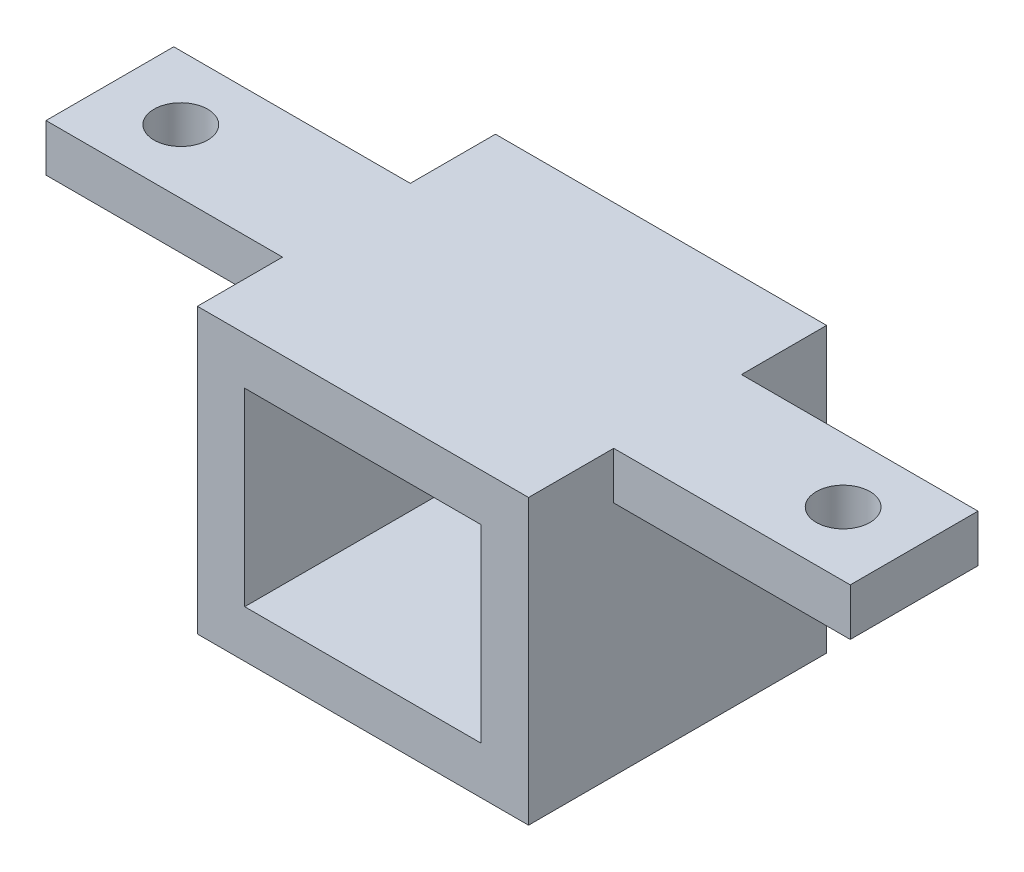
ISO-10303-21;
HEADER;
FILE_DESCRIPTION(('STEP AP214'),'2;1');
FILE_NAME('part.step','',(''),(''),'','','');
FILE_SCHEMA(('AUTOMOTIVE_DESIGN { 1 0 10303 214 1 1 1 1 }'));
ENDSEC;
DATA;
#1=APPLICATION_CONTEXT('core data for automotive mechanical design processes');
#2=APPLICATION_PROTOCOL_DEFINITION('international standard','automotive_design',2000,#1);
#3=PRODUCT_CONTEXT('',#1,'mechanical');
#4=PRODUCT('Part','Part','',(#3));
#5=PRODUCT_RELATED_PRODUCT_CATEGORY('part','',(#4));
#6=PRODUCT_DEFINITION_FORMATION('','',#4);
#7=PRODUCT_DEFINITION_CONTEXT('part definition',#1,'design');
#8=PRODUCT_DEFINITION('design','',#6,#7);
#9=PRODUCT_DEFINITION_SHAPE('','',#8);
#10=(LENGTH_UNIT() NAMED_UNIT(*) SI_UNIT(.MILLI.,.METRE.));
#11=(NAMED_UNIT(*) PLANE_ANGLE_UNIT() SI_UNIT($,.RADIAN.));
#12=(NAMED_UNIT(*) SI_UNIT($,.STERADIAN.) SOLID_ANGLE_UNIT());
#13=UNCERTAINTY_MEASURE_WITH_UNIT(LENGTH_MEASURE(1.E-05),#10,'distance_accuracy_value','');
#14=(GEOMETRIC_REPRESENTATION_CONTEXT(3) GLOBAL_UNCERTAINTY_ASSIGNED_CONTEXT((#13)) GLOBAL_UNIT_ASSIGNED_CONTEXT((#10,
#11,#12)) REPRESENTATION_CONTEXT('',''));
#15=CARTESIAN_POINT('',(0.,0.,0.));
#16=DIRECTION('',(0.,0.,1.));
#17=DIRECTION('',(1.,0.,0.));
#18=AXIS2_PLACEMENT_3D('',#15,#16,#17);
#19=CARTESIAN_POINT('',(0.,0.,0.));
#20=DIRECTION('',(0.,1.,0.));
#21=DIRECTION('',(0.,0.,1.));
#22=AXIS2_PLACEMENT_3D('',#19,#20,#21);
#23=PLANE('',#22);
#24=CARTESIAN_POINT('',(17.78,0.,0.));
#25=DIRECTION('',(0.,-1.,0.));
#26=DIRECTION('',(0.,0.,-1.));
#27=AXIS2_PLACEMENT_3D('',#24,#25,#26);
#28=CIRCLE('',#27,1.44);
#29=CARTESIAN_POINT('',(17.78,0.,-1.44));
#30=VERTEX_POINT('',#29);
#31=EDGE_CURVE('E214',#30,#30,#28,.T.);
#32=ORIENTED_EDGE('',*,*,#31,.F.);
#33=EDGE_LOOP('',(#32));
#34=FACE_BOUND('',#33,.T.);
#35=DIRECTION('',(0.,0.,1.));
#36=VECTOR('',#35,1.);
#37=CARTESIAN_POINT('',(8.89,0.,0.));
#38=LINE('',#37,#36);
#39=CARTESIAN_POINT('',(8.89,0.,-3.429));
#40=VERTEX_POINT('',#39);
#41=CARTESIAN_POINT('',(8.89,0.,3.429));
#42=VERTEX_POINT('',#41);
#43=EDGE_CURVE('E11',#40,#42,#38,.T.);
#44=ORIENTED_EDGE('',*,*,#43,.F.);
#45=DIRECTION('',(1.,0.,0.));
#46=VECTOR('',#45,1.);
#47=CARTESIAN_POINT('',(0.,0.,-3.429));
#48=LINE('',#47,#46);
#49=CARTESIAN_POINT('',(21.59,0.,-3.429));
#50=VERTEX_POINT('',#49);
#51=EDGE_CURVE('E258',#40,#50,#48,.T.);
#52=ORIENTED_EDGE('',*,*,#51,.T.);
#53=DIRECTION('',(0.,0.,1.));
#54=VECTOR('',#53,1.);
#55=CARTESIAN_POINT('',(21.59,0.,0.));
#56=LINE('',#55,#54);
#57=CARTESIAN_POINT('',(21.59,0.,3.429));
#58=VERTEX_POINT('',#57);
#59=EDGE_CURVE('E255',#50,#58,#56,.T.);
#60=ORIENTED_EDGE('',*,*,#59,.T.);
#61=DIRECTION('',(1.,0.,0.));
#62=VECTOR('',#61,1.);
#63=CARTESIAN_POINT('',(0.,0.,3.429));
#64=LINE('',#63,#62);
#65=EDGE_CURVE('E252',#42,#58,#64,.T.);
#66=ORIENTED_EDGE('',*,*,#65,.F.);
#67=EDGE_LOOP('',(#44,#52,#60,#66));
#68=FACE_BOUND('',#67,.T.);
#69=ADVANCED_FACE('F33',(#34,#68),#23,.F.);
#70=CARTESIAN_POINT('',(-17.78,0.,0.));
#71=DIRECTION('',(0.,-1.,0.));
#72=DIRECTION('',(0.,0.,-1.));
#73=AXIS2_PLACEMENT_3D('',#70,#71,#72);
#74=CIRCLE('',#73,1.44000000000011);
#75=CARTESIAN_POINT('',(-17.78,0.,-1.44000000000011));
#76=VERTEX_POINT('',#75);
#77=EDGE_CURVE('E211',#76,#76,#74,.T.);
#78=ORIENTED_EDGE('',*,*,#77,.F.);
#79=EDGE_LOOP('',(#78));
#80=FACE_BOUND('',#79,.T.);
#81=DIRECTION('',(0.,0.,-1.));
#82=VECTOR('',#81,1.);
#83=CARTESIAN_POINT('',(-8.89,0.,0.));
#84=LINE('',#83,#82);
#85=CARTESIAN_POINT('',(-8.89,0.,3.429));
#86=VERTEX_POINT('',#85);
#87=CARTESIAN_POINT('',(-8.89,0.,-3.429));
#88=VERTEX_POINT('',#87);
#89=EDGE_CURVE('E42',#86,#88,#84,.T.);
#90=ORIENTED_EDGE('',*,*,#89,.F.);
#91=DIRECTION('',(-1.,0.,0.));
#92=VECTOR('',#91,1.);
#93=CARTESIAN_POINT('',(0.,0.,3.429));
#94=LINE('',#93,#92);
#95=CARTESIAN_POINT('',(-21.59,0.,3.429));
#96=VERTEX_POINT('',#95);
#97=EDGE_CURVE('E227',#86,#96,#94,.T.);
#98=ORIENTED_EDGE('',*,*,#97,.T.);
#99=DIRECTION('',(0.,0.,1.));
#100=VECTOR('',#99,1.);
#101=CARTESIAN_POINT('',(-21.59,0.,0.));
#102=LINE('',#101,#100);
#103=CARTESIAN_POINT('',(-21.59,0.,-3.429));
#104=VERTEX_POINT('',#103);
#105=EDGE_CURVE('E263',#104,#96,#102,.T.);
#106=ORIENTED_EDGE('',*,*,#105,.F.);
#107=DIRECTION('',(-1.,0.,0.));
#108=VECTOR('',#107,1.);
#109=CARTESIAN_POINT('',(0.,0.,-3.429));
#110=LINE('',#109,#108);
#111=EDGE_CURVE('E261',#88,#104,#110,.T.);
#112=ORIENTED_EDGE('',*,*,#111,.F.);
#113=EDGE_LOOP('',(#90,#98,#106,#112));
#114=FACE_BOUND('',#113,.T.);
#115=ADVANCED_FACE('F329',(#80,#114),#23,.F.);
#116=CARTESIAN_POINT('',(0.,2.54,8.001));
#117=DIRECTION('',(0.,0.,1.));
#118=DIRECTION('',(1.,0.,0.));
#119=AXIS2_PLACEMENT_3D('',#116,#117,#118);
#120=PLANE('',#119);
#121=DIRECTION('',(0.,-1.,0.));
#122=VECTOR('',#121,1.);
#123=CARTESIAN_POINT('',(-8.89,2.54,8.001));
#124=LINE('',#123,#122);
#125=CARTESIAN_POINT('',(-8.89,2.54,8.001));
#126=VERTEX_POINT('',#125);
#127=CARTESIAN_POINT('',(-8.89,-12.7,8.001));
#128=VERTEX_POINT('',#127);
#129=EDGE_CURVE('E196',#126,#128,#124,.T.);
#130=ORIENTED_EDGE('',*,*,#129,.T.);
#131=DIRECTION('',(-1.,0.,0.));
#132=VECTOR('',#131,1.);
#133=CARTESIAN_POINT('',(-8.89,-12.7,8.001));
#134=LINE('',#133,#132);
#135=CARTESIAN_POINT('',(8.89,-12.7,8.001));
#136=VERTEX_POINT('',#135);
#137=EDGE_CURVE('E172',#136,#128,#134,.T.);
#138=ORIENTED_EDGE('',*,*,#137,.F.);
#139=DIRECTION('',(0.,-1.,0.));
#140=VECTOR('',#139,1.);
#141=CARTESIAN_POINT('',(8.89,2.54,8.001));
#142=LINE('',#141,#140);
#143=CARTESIAN_POINT('',(8.89,2.54,8.001));
#144=VERTEX_POINT('',#143);
#145=EDGE_CURVE('E286',#144,#136,#142,.T.);
#146=ORIENTED_EDGE('',*,*,#145,.F.);
#147=DIRECTION('',(-1.,0.,0.));
#148=VECTOR('',#147,1.);
#149=CARTESIAN_POINT('',(0.,2.54,8.001));
#150=LINE('',#149,#148);
#151=EDGE_CURVE('E226',#144,#126,#150,.T.);
#152=ORIENTED_EDGE('',*,*,#151,.T.);
#153=EDGE_LOOP('',(#130,#138,#146,#152));
#154=FACE_BOUND('',#153,.T.);
#155=DIRECTION('',(-1.,0.,0.));
#156=VECTOR('',#155,1.);
#157=CARTESIAN_POINT('',(0.,0.,8.001));
#158=LINE('',#157,#156);
#159=CARTESIAN_POINT('',(6.35,0.,8.001));
#160=VERTEX_POINT('',#159);
#161=CARTESIAN_POINT('',(-6.35,0.,8.001));
#162=VERTEX_POINT('',#161);
#163=EDGE_CURVE('E220',#160,#162,#158,.T.);
#164=ORIENTED_EDGE('',*,*,#163,.F.);
#165=DIRECTION('',(0.,1.,0.));
#166=VECTOR('',#165,1.);
#167=CARTESIAN_POINT('',(6.35,-10.16,8.001));
#168=LINE('',#167,#166);
#169=CARTESIAN_POINT('',(6.35,-10.16,8.001));
#170=VERTEX_POINT('',#169);
#171=EDGE_CURVE('E204',#170,#160,#168,.T.);
#172=ORIENTED_EDGE('',*,*,#171,.F.);
#173=DIRECTION('',(-1.,0.,0.));
#174=VECTOR('',#173,1.);
#175=CARTESIAN_POINT('',(-8.89,-10.16,8.001));
#176=LINE('',#175,#174);
#177=CARTESIAN_POINT('',(-6.35,-10.16,8.001));
#178=VERTEX_POINT('',#177);
#179=EDGE_CURVE('E173',#170,#178,#176,.T.);
#180=ORIENTED_EDGE('',*,*,#179,.T.);
#181=DIRECTION('',(0.,1.,0.));
#182=VECTOR('',#181,1.);
#183=CARTESIAN_POINT('',(-6.35,-10.16,8.001));
#184=LINE('',#183,#182);
#185=EDGE_CURVE('E207',#178,#162,#184,.T.);
#186=ORIENTED_EDGE('',*,*,#185,.T.);
#187=EDGE_LOOP('',(#164,#172,#180,#186));
#188=FACE_BOUND('',#187,.T.);
#189=ADVANCED_FACE('F35',(#154,#188),#120,.T.);
#190=CARTESIAN_POINT('',(0.,2.54,3.429));
#191=DIRECTION('',(0.,0.,-1.));
#192=DIRECTION('',(-1.,0.,0.));
#193=AXIS2_PLACEMENT_3D('',#190,#191,#192);
#194=PLANE('',#193);
#195=ORIENTED_EDGE('',*,*,#65,.T.);
#196=DIRECTION('',(0.,-1.,0.));
#197=VECTOR('',#196,1.);
#198=CARTESIAN_POINT('',(21.59,2.54,3.429));
#199=LINE('',#198,#197);
#200=CARTESIAN_POINT('',(21.59,2.54,3.429));
#201=VERTEX_POINT('',#200);
#202=EDGE_CURVE('E282',#201,#58,#199,.T.);
#203=ORIENTED_EDGE('',*,*,#202,.F.);
#204=DIRECTION('',(1.,0.,0.));
#205=VECTOR('',#204,1.);
#206=CARTESIAN_POINT('',(0.,2.54,3.429));
#207=LINE('',#206,#205);
#208=CARTESIAN_POINT('',(8.89,2.54,3.429));
#209=VERTEX_POINT('',#208);
#210=EDGE_CURVE('E232',#209,#201,#207,.T.);
#211=ORIENTED_EDGE('',*,*,#210,.F.);
#212=DIRECTION('',(0.,-1.,0.));
#213=VECTOR('',#212,1.);
#214=CARTESIAN_POINT('',(8.89,2.54,3.429));
#215=LINE('',#214,#213);
#216=EDGE_CURVE('E284',#209,#42,#215,.T.);
#217=ORIENTED_EDGE('',*,*,#216,.T.);
#218=EDGE_LOOP('',(#195,#203,#211,#217));
#219=FACE_BOUND('',#218,.T.);
#220=ADVANCED_FACE('F411',(#219),#194,.F.);
#221=CARTESIAN_POINT('',(21.59,2.54,0.));
#222=DIRECTION('',(1.,0.,0.));
#223=DIRECTION('',(0.,0.,-1.));
#224=AXIS2_PLACEMENT_3D('',#221,#222,#223);
#225=PLANE('',#224);
#226=ORIENTED_EDGE('',*,*,#59,.F.);
#227=DIRECTION('',(0.,-1.,0.));
#228=VECTOR('',#227,1.);
#229=CARTESIAN_POINT('',(21.59,2.54,-3.429));
#230=LINE('',#229,#228);
#231=CARTESIAN_POINT('',(21.59,2.54,-3.429));
#232=VERTEX_POINT('',#231);
#233=EDGE_CURVE('E280',#232,#50,#230,.T.);
#234=ORIENTED_EDGE('',*,*,#233,.F.);
#235=DIRECTION('',(0.,0.,1.));
#236=VECTOR('',#235,1.);
#237=CARTESIAN_POINT('',(21.59,2.54,0.));
#238=LINE('',#237,#236);
#239=EDGE_CURVE('E235',#232,#201,#238,.T.);
#240=ORIENTED_EDGE('',*,*,#239,.T.);
#241=ORIENTED_EDGE('',*,*,#202,.T.);
#242=EDGE_LOOP('',(#226,#234,#240,#241));
#243=FACE_BOUND('',#242,.T.);
#244=ADVANCED_FACE('F414',(#243),#225,.T.);
#245=CARTESIAN_POINT('',(0.,2.54,-3.429));
#246=DIRECTION('',(0.,0.,-1.));
#247=DIRECTION('',(-1.,0.,0.));
#248=AXIS2_PLACEMENT_3D('',#245,#246,#247);
#249=PLANE('',#248);
#250=ORIENTED_EDGE('',*,*,#51,.F.);
#251=DIRECTION('',(0.,-1.,0.));
#252=VECTOR('',#251,1.);
#253=CARTESIAN_POINT('',(8.89,2.54,-3.429));
#254=LINE('',#253,#252);
#255=CARTESIAN_POINT('',(8.89,2.54,-3.429));
#256=VERTEX_POINT('',#255);
#257=EDGE_CURVE('E277',#256,#40,#254,.T.);
#258=ORIENTED_EDGE('',*,*,#257,.F.);
#259=DIRECTION('',(1.,0.,0.));
#260=VECTOR('',#259,1.);
#261=CARTESIAN_POINT('',(0.,2.54,-3.429));
#262=LINE('',#261,#260);
#263=EDGE_CURVE('E238',#256,#232,#262,.T.);
#264=ORIENTED_EDGE('',*,*,#263,.T.);
#265=ORIENTED_EDGE('',*,*,#233,.T.);
#266=EDGE_LOOP('',(#250,#258,#264,#265));
#267=FACE_BOUND('',#266,.T.);
#268=ADVANCED_FACE('F417',(#267),#249,.T.);
#269=CARTESIAN_POINT('',(8.89,2.54,0.));
#270=DIRECTION('',(-1.,0.,0.));
#271=DIRECTION('',(0.,0.,1.));
#272=AXIS2_PLACEMENT_3D('',#269,#270,#271);
#273=PLANE('',#272);
#274=ORIENTED_EDGE('',*,*,#257,.T.);
#275=ORIENTED_EDGE('',*,*,#43,.T.);
#276=ORIENTED_EDGE('',*,*,#216,.F.);
#277=DIRECTION('',(0.,0.,-1.));
#278=VECTOR('',#277,1.);
#279=CARTESIAN_POINT('',(8.89,2.54,0.));
#280=LINE('',#279,#278);
#281=EDGE_CURVE('E230',#144,#209,#280,.T.);
#282=ORIENTED_EDGE('',*,*,#281,.F.);
#283=ORIENTED_EDGE('',*,*,#145,.T.);
#284=DIRECTION('',(0.,0.,1.));
#285=VECTOR('',#284,1.);
#286=CARTESIAN_POINT('',(8.89,-12.7,8.001));
#287=LINE('',#286,#285);
#288=CARTESIAN_POINT('',(8.89,-12.7,-8.001));
#289=VERTEX_POINT('',#288);
#290=EDGE_CURVE('E167',#289,#136,#287,.T.);
#291=ORIENTED_EDGE('',*,*,#290,.F.);
#292=DIRECTION('',(0.,-1.,0.));
#293=VECTOR('',#292,1.);
#294=CARTESIAN_POINT('',(8.89,2.54,-8.001));
#295=LINE('',#294,#293);
#296=CARTESIAN_POINT('',(8.89,2.54,-8.001));
#297=VERTEX_POINT('',#296);
#298=EDGE_CURVE('E157',#297,#289,#295,.T.);
#299=ORIENTED_EDGE('',*,*,#298,.F.);
#300=EDGE_CURVE('E233',#256,#297,#280,.T.);
#301=ORIENTED_EDGE('',*,*,#300,.F.);
#302=EDGE_LOOP('',(#274,#275,#276,#282,#283,#291,#299,#301));
#303=FACE_BOUND('',#302,.T.);
#304=ADVANCED_FACE('F308',(#303),#273,.F.);
#305=CARTESIAN_POINT('',(0.,2.54,-8.001));
#306=DIRECTION('',(0.,0.,1.));
#307=DIRECTION('',(1.,0.,0.));
#308=AXIS2_PLACEMENT_3D('',#305,#306,#307);
#309=PLANE('',#308);
#310=CARTESIAN_POINT('',(0.,-5.08,-8.001));
#311=DIRECTION('',(0.,0.,-1.));
#312=DIRECTION('',(-1.,0.,0.));
#313=AXIS2_PLACEMENT_3D('',#310,#311,#312);
#314=CIRCLE('',#313,2.);
#315=CARTESIAN_POINT('',(-2.,-5.08,-8.001));
#316=VERTEX_POINT('',#315);
#317=EDGE_CURVE('E292',#316,#316,#314,.T.);
#318=ORIENTED_EDGE('',*,*,#317,.F.);
#319=EDGE_LOOP('',(#318));
#320=FACE_BOUND('',#319,.T.);
#321=CARTESIAN_POINT('',(-4.699,-5.08,-8.001));
#322=DIRECTION('',(0.,0.,-1.));
#323=DIRECTION('',(-1.,0.,0.));
#324=AXIS2_PLACEMENT_3D('',#321,#322,#323);
#325=CIRCLE('',#324,0.800000000000001);
#326=CARTESIAN_POINT('',(-5.499,-5.08,-8.001));
#327=VERTEX_POINT('',#326);
#328=EDGE_CURVE('E297',#327,#327,#325,.T.);
#329=ORIENTED_EDGE('',*,*,#328,.F.);
#330=EDGE_LOOP('',(#329));
#331=FACE_BOUND('',#330,.T.);
#332=CARTESIAN_POINT('',(4.699,-5.08,-8.001));
#333=DIRECTION('',(0.,0.,-1.));
#334=DIRECTION('',(-1.,0.,0.));
#335=AXIS2_PLACEMENT_3D('',#332,#333,#334);
#336=CIRCLE('',#335,0.800000000000001);
#337=CARTESIAN_POINT('',(3.899,-5.08,-8.001));
#338=VERTEX_POINT('',#337);
#339=EDGE_CURVE('E179',#338,#338,#336,.T.);
#340=ORIENTED_EDGE('',*,*,#339,.F.);
#341=EDGE_LOOP('',(#340));
#342=FACE_BOUND('',#341,.T.);
#343=ORIENTED_EDGE('',*,*,#298,.T.);
#344=DIRECTION('',(1.,0.,0.));
#345=VECTOR('',#344,1.);
#346=CARTESIAN_POINT('',(-8.89,-12.7,-8.001));
#347=LINE('',#346,#345);
#348=CARTESIAN_POINT('',(-8.89,-12.7,-8.001));
#349=VERTEX_POINT('',#348);
#350=EDGE_CURVE('E161',#349,#289,#347,.T.);
#351=ORIENTED_EDGE('',*,*,#350,.F.);
#352=DIRECTION('',(0.,-1.,0.));
#353=VECTOR('',#352,1.);
#354=CARTESIAN_POINT('',(-8.89,2.54,-8.001));
#355=LINE('',#354,#353);
#356=CARTESIAN_POINT('',(-8.89,2.54,-8.001));
#357=VERTEX_POINT('',#356);
#358=EDGE_CURVE('E148',#357,#349,#355,.T.);
#359=ORIENTED_EDGE('',*,*,#358,.F.);
#360=DIRECTION('',(-1.,0.,0.));
#361=VECTOR('',#360,1.);
#362=CARTESIAN_POINT('',(0.,2.54,-8.001));
#363=LINE('',#362,#361);
#364=EDGE_CURVE('E241',#297,#357,#363,.T.);
#365=ORIENTED_EDGE('',*,*,#364,.F.);
#366=EDGE_LOOP('',(#343,#351,#359,#365));
#367=FACE_BOUND('',#366,.T.);
#368=ADVANCED_FACE('F162',(#320,#331,#342,#367),#309,.F.);
#369=CARTESIAN_POINT('',(-8.89,2.54,0.));
#370=DIRECTION('',(-1.,0.,0.));
#371=DIRECTION('',(0.,0.,1.));
#372=AXIS2_PLACEMENT_3D('',#369,#370,#371);
#373=PLANE('',#372);
#374=ORIENTED_EDGE('',*,*,#358,.T.);
#375=DIRECTION('',(0.,0.,-1.));
#376=VECTOR('',#375,1.);
#377=CARTESIAN_POINT('',(-8.89,-12.7,8.001));
#378=LINE('',#377,#376);
#379=EDGE_CURVE('E152',#128,#349,#378,.T.);
#380=ORIENTED_EDGE('',*,*,#379,.F.);
#381=ORIENTED_EDGE('',*,*,#129,.F.);
#382=DIRECTION('',(0.,0.,-1.));
#383=VECTOR('',#382,1.);
#384=CARTESIAN_POINT('',(-8.89,2.54,0.));
#385=LINE('',#384,#383);
#386=CARTESIAN_POINT('',(-8.89,2.54,3.429));
#387=VERTEX_POINT('',#386);
#388=EDGE_CURVE('E223',#126,#387,#385,.T.);
#389=ORIENTED_EDGE('',*,*,#388,.T.);
#390=DIRECTION('',(0.,-1.,0.));
#391=VECTOR('',#390,1.);
#392=CARTESIAN_POINT('',(-8.89,2.54,3.429));
#393=LINE('',#392,#391);
#394=EDGE_CURVE('E250',#387,#86,#393,.T.);
#395=ORIENTED_EDGE('',*,*,#394,.T.);
#396=ORIENTED_EDGE('',*,*,#89,.T.);
#397=DIRECTION('',(0.,-1.,0.));
#398=VECTOR('',#397,1.);
#399=CARTESIAN_POINT('',(-8.89,2.54,-3.429));
#400=LINE('',#399,#398);
#401=CARTESIAN_POINT('',(-8.89,2.54,-3.429));
#402=VERTEX_POINT('',#401);
#403=EDGE_CURVE('E158',#402,#88,#400,.T.);
#404=ORIENTED_EDGE('',*,*,#403,.F.);
#405=EDGE_CURVE('E154',#402,#357,#385,.T.);
#406=ORIENTED_EDGE('',*,*,#405,.T.);
#407=EDGE_LOOP('',(#374,#380,#381,#389,#395,#396,#404,#406));
#408=FACE_BOUND('',#407,.T.);
#409=ADVANCED_FACE('F150',(#408),#373,.T.);
#410=CARTESIAN_POINT('',(0.,2.54,-3.429));
#411=DIRECTION('',(0.,0.,1.));
#412=DIRECTION('',(1.,0.,0.));
#413=AXIS2_PLACEMENT_3D('',#410,#411,#412);
#414=PLANE('',#413);
#415=ORIENTED_EDGE('',*,*,#111,.T.);
#416=DIRECTION('',(0.,-1.,0.));
#417=VECTOR('',#416,1.);
#418=CARTESIAN_POINT('',(-21.59,2.54,-3.429));
#419=LINE('',#418,#417);
#420=CARTESIAN_POINT('',(-21.59,2.54,-3.429));
#421=VERTEX_POINT('',#420);
#422=EDGE_CURVE('E272',#421,#104,#419,.T.);
#423=ORIENTED_EDGE('',*,*,#422,.F.);
#424=DIRECTION('',(-1.,0.,0.));
#425=VECTOR('',#424,1.);
#426=CARTESIAN_POINT('',(0.,2.54,-3.429));
#427=LINE('',#426,#425);
#428=EDGE_CURVE('E243',#402,#421,#427,.T.);
#429=ORIENTED_EDGE('',*,*,#428,.F.);
#430=ORIENTED_EDGE('',*,*,#403,.T.);
#431=EDGE_LOOP('',(#415,#423,#429,#430));
#432=FACE_BOUND('',#431,.T.);
#433=ADVANCED_FACE('F397',(#432),#414,.F.);
#434=CARTESIAN_POINT('',(-21.59,2.54,0.));
#435=DIRECTION('',(1.,0.,0.));
#436=DIRECTION('',(0.,0.,-1.));
#437=AXIS2_PLACEMENT_3D('',#434,#435,#436);
#438=PLANE('',#437);
#439=ORIENTED_EDGE('',*,*,#105,.T.);
#440=DIRECTION('',(0.,-1.,0.));
#441=VECTOR('',#440,1.);
#442=CARTESIAN_POINT('',(-21.59,2.54,3.429));
#443=LINE('',#442,#441);
#444=CARTESIAN_POINT('',(-21.59,2.54,3.429));
#445=VERTEX_POINT('',#444);
#446=EDGE_CURVE('E270',#445,#96,#443,.T.);
#447=ORIENTED_EDGE('',*,*,#446,.F.);
#448=DIRECTION('',(0.,0.,1.));
#449=VECTOR('',#448,1.);
#450=CARTESIAN_POINT('',(-21.59,2.54,0.));
#451=LINE('',#450,#449);
#452=EDGE_CURVE('E245',#421,#445,#451,.T.);
#453=ORIENTED_EDGE('',*,*,#452,.F.);
#454=ORIENTED_EDGE('',*,*,#422,.T.);
#455=EDGE_LOOP('',(#439,#447,#453,#454));
#456=FACE_BOUND('',#455,.T.);
#457=ADVANCED_FACE('F393',(#456),#438,.F.);
#458=CARTESIAN_POINT('',(0.,2.54,3.429));
#459=DIRECTION('',(0.,0.,1.));
#460=DIRECTION('',(1.,0.,0.));
#461=AXIS2_PLACEMENT_3D('',#458,#459,#460);
#462=PLANE('',#461);
#463=ORIENTED_EDGE('',*,*,#97,.F.);
#464=ORIENTED_EDGE('',*,*,#394,.F.);
#465=DIRECTION('',(-1.,0.,0.));
#466=VECTOR('',#465,1.);
#467=CARTESIAN_POINT('',(0.,2.54,3.429));
#468=LINE('',#467,#466);
#469=EDGE_CURVE('E247',#387,#445,#468,.T.);
#470=ORIENTED_EDGE('',*,*,#469,.T.);
#471=ORIENTED_EDGE('',*,*,#446,.T.);
#472=EDGE_LOOP('',(#463,#464,#470,#471));
#473=FACE_BOUND('',#472,.T.);
#474=ADVANCED_FACE('F351',(#473),#462,.T.);
#475=CARTESIAN_POINT('',(0.,2.54,0.));
#476=DIRECTION('',(0.,1.,0.));
#477=DIRECTION('',(0.,0.,1.));
#478=AXIS2_PLACEMENT_3D('',#475,#476,#477);
#479=PLANE('',#478);
#480=CARTESIAN_POINT('',(-17.78,2.54,0.));
#481=DIRECTION('',(0.,-1.,0.));
#482=DIRECTION('',(0.,0.,-1.));
#483=AXIS2_PLACEMENT_3D('',#480,#481,#482);
#484=CIRCLE('',#483,1.44000000000011);
#485=CARTESIAN_POINT('',(-17.78,2.54,-1.44000000000011));
#486=VERTEX_POINT('',#485);
#487=EDGE_CURVE('E210',#486,#486,#484,.T.);
#488=ORIENTED_EDGE('',*,*,#487,.T.);
#489=EDGE_LOOP('',(#488));
#490=FACE_BOUND('',#489,.T.);
#491=CARTESIAN_POINT('',(17.78,2.54,0.));
#492=DIRECTION('',(0.,-1.,0.));
#493=DIRECTION('',(0.,0.,-1.));
#494=AXIS2_PLACEMENT_3D('',#491,#492,#493);
#495=CIRCLE('',#494,1.44);
#496=CARTESIAN_POINT('',(17.78,2.54,-1.44));
#497=VERTEX_POINT('',#496);
#498=EDGE_CURVE('E217',#497,#497,#495,.T.);
#499=ORIENTED_EDGE('',*,*,#498,.T.);
#500=EDGE_LOOP('',(#499));
#501=FACE_BOUND('',#500,.T.);
#502=ORIENTED_EDGE('',*,*,#388,.F.);
#503=ORIENTED_EDGE('',*,*,#151,.F.);
#504=ORIENTED_EDGE('',*,*,#281,.T.);
#505=ORIENTED_EDGE('',*,*,#210,.T.);
#506=ORIENTED_EDGE('',*,*,#239,.F.);
#507=ORIENTED_EDGE('',*,*,#263,.F.);
#508=ORIENTED_EDGE('',*,*,#300,.T.);
#509=ORIENTED_EDGE('',*,*,#364,.T.);
#510=ORIENTED_EDGE('',*,*,#405,.F.);
#511=ORIENTED_EDGE('',*,*,#428,.T.);
#512=ORIENTED_EDGE('',*,*,#452,.T.);
#513=ORIENTED_EDGE('',*,*,#469,.F.);
#514=EDGE_LOOP('',(#502,#503,#504,#505,#506,#507,#508,#509,#510,#511,#512,#513));
#515=FACE_BOUND('',#514,.T.);
#516=ADVANCED_FACE('F343',(#490,#501,#515),#479,.T.);
#517=ORIENTED_EDGE('',*,*,#163,.T.);
#518=DIRECTION('',(0.,0.,-1.));
#519=VECTOR('',#518,1.);
#520=CARTESIAN_POINT('',(-6.35,0.,0.));
#521=LINE('',#520,#519);
#522=CARTESIAN_POINT('',(-6.35,0.,-5.461));
#523=VERTEX_POINT('',#522);
#524=EDGE_CURVE('E50',#162,#523,#521,.T.);
#525=ORIENTED_EDGE('',*,*,#524,.T.);
#526=DIRECTION('',(1.,0.,0.));
#527=VECTOR('',#526,1.);
#528=CARTESIAN_POINT('',(0.,0.,-5.461));
#529=LINE('',#528,#527);
#530=CARTESIAN_POINT('',(6.35,0.,-5.461));
#531=VERTEX_POINT('',#530);
#532=EDGE_CURVE('E55',#523,#531,#529,.T.);
#533=ORIENTED_EDGE('',*,*,#532,.T.);
#534=DIRECTION('',(0.,0.,-1.));
#535=VECTOR('',#534,1.);
#536=CARTESIAN_POINT('',(6.35,0.,0.));
#537=LINE('',#536,#535);
#538=EDGE_CURVE('E194',#160,#531,#537,.T.);
#539=ORIENTED_EDGE('',*,*,#538,.F.);
#540=EDGE_LOOP('',(#517,#525,#533,#539));
#541=FACE_BOUND('',#540,.T.);
#542=ADVANCED_FACE('F332',(#541),#23,.F.);
#543=CARTESIAN_POINT('',(17.78,2.54,0.));
#544=DIRECTION('',(0.,-1.,0.));
#545=DIRECTION('',(0.,0.,-1.));
#546=AXIS2_PLACEMENT_3D('',#543,#544,#545);
#547=CYLINDRICAL_SURFACE('',#546,1.44);
#548=ORIENTED_EDGE('',*,*,#498,.F.);
#549=EDGE_LOOP('',(#548));
#550=FACE_BOUND('',#549,.T.);
#551=ORIENTED_EDGE('',*,*,#31,.T.);
#552=EDGE_LOOP('',(#551));
#553=FACE_BOUND('',#552,.T.);
#554=ADVANCED_FACE('F342',(#550,#553),#547,.F.);
#555=CARTESIAN_POINT('',(-17.78,2.54,0.));
#556=DIRECTION('',(0.,-1.,0.));
#557=DIRECTION('',(0.,0.,-1.));
#558=AXIS2_PLACEMENT_3D('',#555,#556,#557);
#559=CYLINDRICAL_SURFACE('',#558,1.44000000000011);
#560=ORIENTED_EDGE('',*,*,#487,.F.);
#561=EDGE_LOOP('',(#560));
#562=FACE_BOUND('',#561,.T.);
#563=ORIENTED_EDGE('',*,*,#77,.T.);
#564=EDGE_LOOP('',(#563));
#565=FACE_BOUND('',#564,.T.);
#566=ADVANCED_FACE('F348',(#562,#565),#559,.F.);
#567=CARTESIAN_POINT('',(-6.35,-10.16,0.));
#568=DIRECTION('',(1.,0.,0.));
#569=DIRECTION('',(0.,0.,-1.));
#570=AXIS2_PLACEMENT_3D('',#567,#568,#569);
#571=PLANE('',#570);
#572=ORIENTED_EDGE('',*,*,#524,.F.);
#573=ORIENTED_EDGE('',*,*,#185,.F.);
#574=DIRECTION('',(0.,0.,-1.));
#575=VECTOR('',#574,1.);
#576=CARTESIAN_POINT('',(-6.35,-10.16,0.));
#577=LINE('',#576,#575);
#578=CARTESIAN_POINT('',(-6.35,-10.16,-5.461));
#579=VERTEX_POINT('',#578);
#580=EDGE_CURVE('E184',#178,#579,#577,.T.);
#581=ORIENTED_EDGE('',*,*,#580,.T.);
#582=DIRECTION('',(0.,1.,0.));
#583=VECTOR('',#582,1.);
#584=CARTESIAN_POINT('',(-6.35,-10.16,-5.461));
#585=LINE('',#584,#583);
#586=EDGE_CURVE('E192',#579,#523,#585,.T.);
#587=ORIENTED_EDGE('',*,*,#586,.T.);
#588=EDGE_LOOP('',(#572,#573,#581,#587));
#589=FACE_BOUND('',#588,.T.);
#590=ADVANCED_FACE('F358',(#589),#571,.T.);
#591=CARTESIAN_POINT('',(6.35,-10.16,0.));
#592=DIRECTION('',(1.,0.,0.));
#593=DIRECTION('',(0.,0.,-1.));
#594=AXIS2_PLACEMENT_3D('',#591,#592,#593);
#595=PLANE('',#594);
#596=ORIENTED_EDGE('',*,*,#538,.T.);
#597=DIRECTION('',(0.,1.,0.));
#598=VECTOR('',#597,1.);
#599=CARTESIAN_POINT('',(6.35,-10.16,-5.461));
#600=LINE('',#599,#598);
#601=CARTESIAN_POINT('',(6.35,-10.16,-5.461));
#602=VERTEX_POINT('',#601);
#603=EDGE_CURVE('E202',#602,#531,#600,.T.);
#604=ORIENTED_EDGE('',*,*,#603,.F.);
#605=DIRECTION('',(0.,0.,-1.));
#606=VECTOR('',#605,1.);
#607=CARTESIAN_POINT('',(6.35,-10.16,0.));
#608=LINE('',#607,#606);
#609=EDGE_CURVE('E187',#170,#602,#608,.T.);
#610=ORIENTED_EDGE('',*,*,#609,.F.);
#611=ORIENTED_EDGE('',*,*,#171,.T.);
#612=EDGE_LOOP('',(#596,#604,#610,#611));
#613=FACE_BOUND('',#612,.T.);
#614=ADVANCED_FACE('F365',(#613),#595,.F.);
#615=CARTESIAN_POINT('',(0.,-10.16,-5.461));
#616=DIRECTION('',(0.,0.,1.));
#617=DIRECTION('',(1.,0.,0.));
#618=AXIS2_PLACEMENT_3D('',#615,#616,#617);
#619=PLANE('',#618);
#620=CARTESIAN_POINT('',(0.,-5.08,-5.461));
#621=DIRECTION('',(0.,0.,1.));
#622=DIRECTION('',(1.,0.,0.));
#623=AXIS2_PLACEMENT_3D('',#620,#621,#622);
#624=CIRCLE('',#623,2.);
#625=CARTESIAN_POINT('',(2.,-5.08,-5.461));
#626=VERTEX_POINT('',#625);
#627=EDGE_CURVE('E37',#626,#626,#624,.T.);
#628=ORIENTED_EDGE('',*,*,#627,.F.);
#629=EDGE_LOOP('',(#628));
#630=FACE_BOUND('',#629,.T.);
#631=CARTESIAN_POINT('',(-4.699,-5.08,-5.461));
#632=DIRECTION('',(0.,0.,1.));
#633=DIRECTION('',(1.,0.,0.));
#634=AXIS2_PLACEMENT_3D('',#631,#632,#633);
#635=CIRCLE('',#634,0.800000000000001);
#636=CARTESIAN_POINT('',(-3.899,-5.08,-5.461));
#637=VERTEX_POINT('',#636);
#638=EDGE_CURVE('E290',#637,#637,#635,.T.);
#639=ORIENTED_EDGE('',*,*,#638,.F.);
#640=EDGE_LOOP('',(#639));
#641=FACE_BOUND('',#640,.T.);
#642=CARTESIAN_POINT('',(4.699,-5.08,-5.461));
#643=DIRECTION('',(0.,0.,1.));
#644=DIRECTION('',(1.,0.,0.));
#645=AXIS2_PLACEMENT_3D('',#642,#643,#644);
#646=CIRCLE('',#645,0.800000000000001);
#647=CARTESIAN_POINT('',(5.499,-5.08,-5.461));
#648=VERTEX_POINT('',#647);
#649=EDGE_CURVE('E176',#648,#648,#646,.T.);
#650=ORIENTED_EDGE('',*,*,#649,.F.);
#651=EDGE_LOOP('',(#650));
#652=FACE_BOUND('',#651,.T.);
#653=ORIENTED_EDGE('',*,*,#532,.F.);
#654=ORIENTED_EDGE('',*,*,#586,.F.);
#655=DIRECTION('',(1.,0.,0.));
#656=VECTOR('',#655,1.);
#657=CARTESIAN_POINT('',(0.,-10.16,-5.461));
#658=LINE('',#657,#656);
#659=EDGE_CURVE('E189',#579,#602,#658,.T.);
#660=ORIENTED_EDGE('',*,*,#659,.T.);
#661=ORIENTED_EDGE('',*,*,#603,.T.);
#662=EDGE_LOOP('',(#653,#654,#660,#661));
#663=FACE_BOUND('',#662,.T.);
#664=ADVANCED_FACE('F361',(#630,#641,#652,#663),#619,.T.);
#665=CARTESIAN_POINT('',(0.,-12.7,0.));
#666=DIRECTION('',(0.,-1.,0.));
#667=DIRECTION('',(0.,0.,-1.));
#668=AXIS2_PLACEMENT_3D('',#665,#666,#667);
#669=PLANE('',#668);
#670=ORIENTED_EDGE('',*,*,#379,.T.);
#671=ORIENTED_EDGE('',*,*,#350,.T.);
#672=ORIENTED_EDGE('',*,*,#290,.T.);
#673=ORIENTED_EDGE('',*,*,#137,.T.);
#674=EDGE_LOOP('',(#670,#671,#672,#673));
#675=FACE_BOUND('',#674,.T.);
#676=ADVANCED_FACE('F170',(#675),#669,.T.);
#677=CARTESIAN_POINT('',(0.,-10.16,0.));
#678=DIRECTION('',(0.,-1.,0.));
#679=DIRECTION('',(0.,0.,-1.));
#680=AXIS2_PLACEMENT_3D('',#677,#678,#679);
#681=PLANE('',#680);
#682=ORIENTED_EDGE('',*,*,#580,.F.);
#683=ORIENTED_EDGE('',*,*,#179,.F.);
#684=ORIENTED_EDGE('',*,*,#609,.T.);
#685=ORIENTED_EDGE('',*,*,#659,.F.);
#686=EDGE_LOOP('',(#682,#683,#684,#685));
#687=FACE_BOUND('',#686,.T.);
#688=ADVANCED_FACE('F316',(#687),#681,.F.);
#689=CARTESIAN_POINT('',(4.699,-5.08,8.001));
#690=DIRECTION('',(0.,0.,-1.));
#691=DIRECTION('',(-1.,0.,0.));
#692=AXIS2_PLACEMENT_3D('',#689,#690,#691);
#693=CYLINDRICAL_SURFACE('',#692,0.800000000000001);
#694=ORIENTED_EDGE('',*,*,#649,.T.);
#695=EDGE_LOOP('',(#694));
#696=FACE_BOUND('',#695,.T.);
#697=ORIENTED_EDGE('',*,*,#339,.T.);
#698=EDGE_LOOP('',(#697));
#699=FACE_BOUND('',#698,.T.);
#700=ADVANCED_FACE('F314',(#696,#699),#693,.F.);
#701=CARTESIAN_POINT('',(-4.699,-5.08,8.001));
#702=DIRECTION('',(0.,0.,-1.));
#703=DIRECTION('',(-1.,0.,0.));
#704=AXIS2_PLACEMENT_3D('',#701,#702,#703);
#705=CYLINDRICAL_SURFACE('',#704,0.800000000000001);
#706=ORIENTED_EDGE('',*,*,#638,.T.);
#707=EDGE_LOOP('',(#706));
#708=FACE_BOUND('',#707,.T.);
#709=ORIENTED_EDGE('',*,*,#328,.T.);
#710=EDGE_LOOP('',(#709));
#711=FACE_BOUND('',#710,.T.);
#712=ADVANCED_FACE('F304',(#708,#711),#705,.F.);
#713=CARTESIAN_POINT('',(0.,-5.08,8.001));
#714=DIRECTION('',(0.,0.,-1.));
#715=DIRECTION('',(-1.,0.,0.));
#716=AXIS2_PLACEMENT_3D('',#713,#714,#715);
#717=CYLINDRICAL_SURFACE('',#716,2.);
#718=ORIENTED_EDGE('',*,*,#627,.T.);
#719=EDGE_LOOP('',(#718));
#720=FACE_BOUND('',#719,.T.);
#721=ORIENTED_EDGE('',*,*,#317,.T.);
#722=EDGE_LOOP('',(#721));
#723=FACE_BOUND('',#722,.T.);
#724=ADVANCED_FACE('F323',(#720,#723),#717,.F.);
#725=CLOSED_SHELL('',(#69,#115,#189,#220,#244,#268,#304,#368,#409,#433,#457,#474,#516,#542,#554,
#566,#590,#614,#664,#676,#688,#700,#712,#724));
#726=MANIFOLD_SOLID_BREP('B2',#725);
#727=ADVANCED_BREP_SHAPE_REPRESENTATION('',(#18,#726),#14);
#728=SHAPE_DEFINITION_REPRESENTATION(#9,#727);
ENDSEC;
END-ISO-10303-21;
